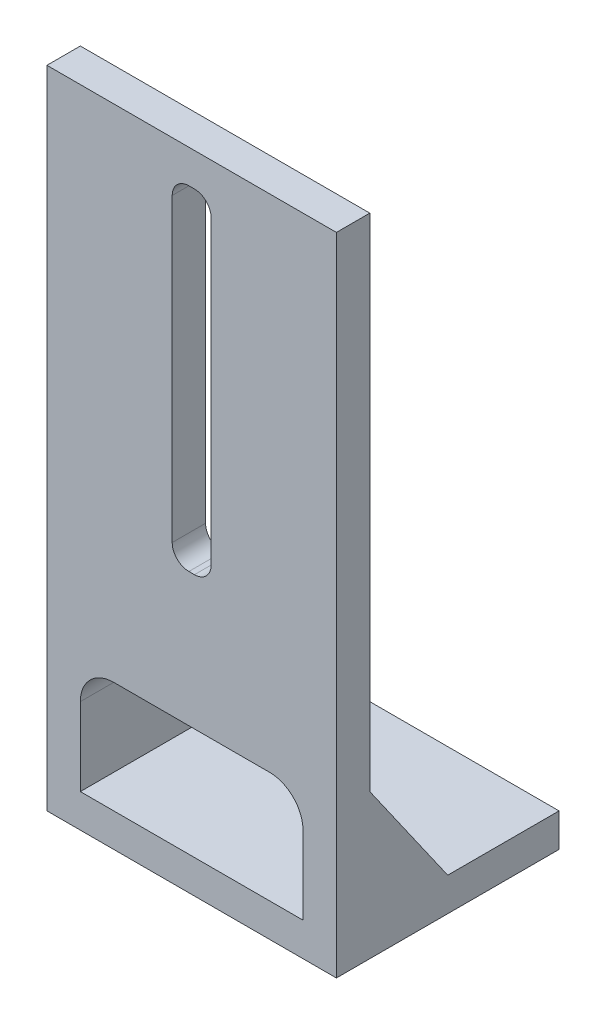
ISO-10303-21;
HEADER;
FILE_DESCRIPTION(('STEP AP214'),'2;1');
FILE_NAME('part.step','',(''),(''),'','','');
FILE_SCHEMA(('AUTOMOTIVE_DESIGN { 1 0 10303 214 1 1 1 1 }'));
ENDSEC;
DATA;
#1=APPLICATION_CONTEXT('core data for automotive mechanical design processes');
#2=APPLICATION_PROTOCOL_DEFINITION('international standard','automotive_design',2000,#1);
#3=PRODUCT_CONTEXT('',#1,'mechanical');
#4=PRODUCT('Part','Part','',(#3));
#5=PRODUCT_RELATED_PRODUCT_CATEGORY('part','',(#4));
#6=PRODUCT_DEFINITION_FORMATION('','',#4);
#7=PRODUCT_DEFINITION_CONTEXT('part definition',#1,'design');
#8=PRODUCT_DEFINITION('design','',#6,#7);
#9=PRODUCT_DEFINITION_SHAPE('','',#8);
#10=(LENGTH_UNIT() NAMED_UNIT(*) SI_UNIT(.MILLI.,.METRE.));
#11=(NAMED_UNIT(*) PLANE_ANGLE_UNIT() SI_UNIT($,.RADIAN.));
#12=(NAMED_UNIT(*) SI_UNIT($,.STERADIAN.) SOLID_ANGLE_UNIT());
#13=UNCERTAINTY_MEASURE_WITH_UNIT(LENGTH_MEASURE(1.E-05),#10,'distance_accuracy_value','');
#14=(GEOMETRIC_REPRESENTATION_CONTEXT(3) GLOBAL_UNCERTAINTY_ASSIGNED_CONTEXT((#13)) GLOBAL_UNIT_ASSIGNED_CONTEXT((#10,
#11,#12)) REPRESENTATION_CONTEXT('',''));
#15=CARTESIAN_POINT('',(0.,0.,0.));
#16=DIRECTION('',(0.,0.,1.));
#17=DIRECTION('',(1.,0.,0.));
#18=AXIS2_PLACEMENT_3D('',#15,#16,#17);
#19=CARTESIAN_POINT('',(0.,3.,0.));
#20=DIRECTION('',(0.,1.,0.));
#21=DIRECTION('',(0.,0.,1.));
#22=AXIS2_PLACEMENT_3D('',#19,#20,#21);
#23=PLANE('',#22);
#24=DIRECTION('',(0.,0.,1.));
#25=VECTOR('',#24,1.);
#26=CARTESIAN_POINT('',(18.0779936587407,3.,7.95820729539502));
#27=LINE('',#26,#25);
#28=CARTESIAN_POINT('',(18.0779936587407,3.,0.958207295395011));
#29=VERTEX_POINT('',#28);
#30=CARTESIAN_POINT('',(18.0779936587407,3.,10.958207295395));
#31=VERTEX_POINT('',#30);
#32=EDGE_CURVE('E175',#29,#31,#27,.T.);
#33=ORIENTED_EDGE('',*,*,#32,.F.);
#34=DIRECTION('',(-1.,0.,0.));
#35=VECTOR('',#34,1.);
#36=CARTESIAN_POINT('',(18.0779936587407,3.,0.958207295395016));
#37=LINE('',#36,#35);
#38=CARTESIAN_POINT('',(21.0779936587407,3.,0.95820729539501));
#39=VERTEX_POINT('',#38);
#40=EDGE_CURVE('E188',#39,#29,#37,.T.);
#41=ORIENTED_EDGE('',*,*,#40,.F.);
#42=DIRECTION('',(0.,0.,-1.));
#43=VECTOR('',#42,1.);
#44=CARTESIAN_POINT('',(21.0779936587407,3.,-9.04179270460499));
#45=LINE('',#44,#43);
#46=CARTESIAN_POINT('',(21.0779936587407,3.,-9.04179270460499));
#47=VERTEX_POINT('',#46);
#48=EDGE_CURVE('E251',#39,#47,#45,.T.);
#49=ORIENTED_EDGE('',*,*,#48,.T.);
#50=DIRECTION('',(-1.,0.,0.));
#51=VECTOR('',#50,1.);
#52=CARTESIAN_POINT('',(-4.92200634125928,3.,-9.04179270460499));
#53=LINE('',#52,#51);
#54=CARTESIAN_POINT('',(-4.92200634125928,3.,-9.04179270460499));
#55=VERTEX_POINT('',#54);
#56=EDGE_CURVE('E254',#47,#55,#53,.T.);
#57=ORIENTED_EDGE('',*,*,#56,.T.);
#58=DIRECTION('',(0.,0.,1.));
#59=VECTOR('',#58,1.);
#60=CARTESIAN_POINT('',(-4.92200634125928,3.,-9.04179270460499));
#61=LINE('',#60,#59);
#62=CARTESIAN_POINT('',(-4.92200634125928,3.,0.958207295395017));
#63=VERTEX_POINT('',#62);
#64=EDGE_CURVE('E248',#55,#63,#61,.T.);
#65=ORIENTED_EDGE('',*,*,#64,.T.);
#66=DIRECTION('',(-1.,0.,0.));
#67=VECTOR('',#66,1.);
#68=CARTESIAN_POINT('',(-4.92200634125928,3.,0.958207295395016));
#69=LINE('',#68,#67);
#70=CARTESIAN_POINT('',(-1.92200634125929,3.,0.958207295395016));
#71=VERTEX_POINT('',#70);
#72=EDGE_CURVE('E228',#71,#63,#69,.T.);
#73=ORIENTED_EDGE('',*,*,#72,.F.);
#74=DIRECTION('',(0.,0.,-1.));
#75=VECTOR('',#74,1.);
#76=CARTESIAN_POINT('',(-1.92200634125928,3.,7.95820729539502));
#77=LINE('',#76,#75);
#78=CARTESIAN_POINT('',(-1.92200634125928,3.,10.958207295395));
#79=VERTEX_POINT('',#78);
#80=EDGE_CURVE('E195',#79,#71,#77,.T.);
#81=ORIENTED_EDGE('',*,*,#80,.F.);
#82=DIRECTION('',(1.,0.,0.));
#83=VECTOR('',#82,1.);
#84=CARTESIAN_POINT('',(18.0779936587407,3.,10.958207295395));
#85=LINE('',#84,#83);
#86=EDGE_CURVE('E192',#79,#31,#85,.T.);
#87=ORIENTED_EDGE('',*,*,#86,.T.);
#88=EDGE_LOOP('',(#33,#41,#49,#57,#65,#73,#81,#87));
#89=FACE_BOUND('',#88,.T.);
#90=ADVANCED_FACE('F32',(#89),#23,.T.);
#91=CARTESIAN_POINT('',(21.0779936587407,58.,7.95820729539501));
#92=DIRECTION('',(0.,0.,1.));
#93=DIRECTION('',(1.,0.,0.));
#94=AXIS2_PLACEMENT_3D('',#91,#92,#93);
#95=PLANE('',#94);
#96=DIRECTION('',(0.,1.,0.));
#97=VECTOR('',#96,1.);
#98=CARTESIAN_POINT('',(6.32799365874073,0.,7.95820729539502));
#99=LINE('',#98,#97);
#100=CARTESIAN_POINT('',(6.32799365874073,26.5,7.95820729539502));
#101=VERTEX_POINT('',#100);
#102=CARTESIAN_POINT('',(6.32799365874072,53.5,7.95820729539502));
#103=VERTEX_POINT('',#102);
#104=EDGE_CURVE('E336',#101,#103,#99,.T.);
#105=ORIENTED_EDGE('',*,*,#104,.F.);
#106=CARTESIAN_POINT('',(7.82799365874073,26.5,7.95820729539502));
#107=DIRECTION('',(0.,0.,1.));
#108=DIRECTION('',(1.,0.,0.));
#109=AXIS2_PLACEMENT_3D('',#106,#107,#108);
#110=CIRCLE('',#109,1.5);
#111=CARTESIAN_POINT('',(7.82799365874073,25.,7.95820729539501));
#112=VERTEX_POINT('',#111);
#113=EDGE_CURVE('E313',#101,#112,#110,.T.);
#114=ORIENTED_EDGE('',*,*,#113,.T.);
#115=DIRECTION('',(-1.,0.,0.));
#116=VECTOR('',#115,1.);
#117=CARTESIAN_POINT('',(0.,25.,7.95820729539502));
#118=LINE('',#117,#116);
#119=CARTESIAN_POINT('',(8.32799365874074,25.,7.95820729539501));
#120=VERTEX_POINT('',#119);
#121=EDGE_CURVE('E399',#120,#112,#118,.T.);
#122=ORIENTED_EDGE('',*,*,#121,.F.);
#123=CARTESIAN_POINT('',(8.32799365874074,26.5,7.95820729539501));
#124=DIRECTION('',(0.,0.,1.));
#125=DIRECTION('',(1.,0.,0.));
#126=AXIS2_PLACEMENT_3D('',#123,#124,#125);
#127=CIRCLE('',#126,1.5);
#128=CARTESIAN_POINT('',(9.82799365874074,26.5,7.95820729539501));
#129=VERTEX_POINT('',#128);
#130=EDGE_CURVE('E317',#120,#129,#127,.T.);
#131=ORIENTED_EDGE('',*,*,#130,.T.);
#132=DIRECTION('',(0.,-1.,0.));
#133=VECTOR('',#132,1.);
#134=CARTESIAN_POINT('',(9.82799365874076,0.,7.95820729539501));
#135=LINE('',#134,#133);
#136=CARTESIAN_POINT('',(9.82799365874072,53.5,7.95820729539501));
#137=VERTEX_POINT('',#136);
#138=EDGE_CURVE('E332',#137,#129,#135,.T.);
#139=ORIENTED_EDGE('',*,*,#138,.F.);
#140=CARTESIAN_POINT('',(8.32799365874072,53.5,7.95820729539501));
#141=DIRECTION('',(0.,0.,1.));
#142=DIRECTION('',(1.,0.,0.));
#143=AXIS2_PLACEMENT_3D('',#140,#141,#142);
#144=CIRCLE('',#143,1.5);
#145=CARTESIAN_POINT('',(8.32799365874072,55.,7.95820729539501));
#146=VERTEX_POINT('',#145);
#147=EDGE_CURVE('E320',#137,#146,#144,.T.);
#148=ORIENTED_EDGE('',*,*,#147,.T.);
#149=DIRECTION('',(1.,0.,0.));
#150=VECTOR('',#149,1.);
#151=CARTESIAN_POINT('',(0.,55.,7.95820729539502));
#152=LINE('',#151,#150);
#153=CARTESIAN_POINT('',(7.82799365874072,55.,7.95820729539501));
#154=VERTEX_POINT('',#153);
#155=EDGE_CURVE('E329',#154,#146,#152,.T.);
#156=ORIENTED_EDGE('',*,*,#155,.F.);
#157=CARTESIAN_POINT('',(7.82799365874072,53.5,7.95820729539502));
#158=DIRECTION('',(0.,0.,1.));
#159=DIRECTION('',(1.,0.,0.));
#160=AXIS2_PLACEMENT_3D('',#157,#158,#159);
#161=CIRCLE('',#160,1.5);
#162=EDGE_CURVE('E11',#154,#103,#161,.T.);
#163=ORIENTED_EDGE('',*,*,#162,.T.);
#164=EDGE_LOOP('',(#105,#114,#122,#131,#139,#148,#156,#163));
#165=FACE_BOUND('',#164,.T.);
#166=DIRECTION('',(1.,0.,0.));
#167=VECTOR('',#166,1.);
#168=CARTESIAN_POINT('',(18.0779936587407,13.,7.95820729539502));
#169=LINE('',#168,#167);
#170=CARTESIAN_POINT('',(15.0779936587407,13.,7.95820729539501));
#171=VERTEX_POINT('',#170);
#172=CARTESIAN_POINT('',(21.0779936587407,13.,7.95820729539501));
#173=VERTEX_POINT('',#172);
#174=EDGE_CURVE('E187',#171,#173,#169,.T.);
#175=ORIENTED_EDGE('',*,*,#174,.F.);
#176=DIRECTION('',(1.,0.,0.));
#177=VECTOR('',#176,1.);
#178=CARTESIAN_POINT('',(18.0779936587407,13.,7.95820729539501));
#179=LINE('',#178,#177);
#180=CARTESIAN_POINT('',(1.07799365874072,13.,7.95820729539502));
#181=VERTEX_POINT('',#180);
#182=EDGE_CURVE('E199',#181,#171,#179,.T.);
#183=ORIENTED_EDGE('',*,*,#182,.F.);
#184=DIRECTION('',(1.,0.,0.));
#185=VECTOR('',#184,1.);
#186=CARTESIAN_POINT('',(-4.92200634125928,13.,7.95820729539502));
#187=LINE('',#186,#185);
#188=CARTESIAN_POINT('',(-4.92200634125928,13.,7.95820729539502));
#189=VERTEX_POINT('',#188);
#190=EDGE_CURVE('E225',#189,#181,#187,.T.);
#191=ORIENTED_EDGE('',*,*,#190,.F.);
#192=DIRECTION('',(0.,-1.,0.));
#193=VECTOR('',#192,1.);
#194=CARTESIAN_POINT('',(-4.92200634125928,58.,7.95820729539502));
#195=LINE('',#194,#193);
#196=CARTESIAN_POINT('',(-4.92200634125928,58.,7.95820729539502));
#197=VERTEX_POINT('',#196);
#198=EDGE_CURVE('E241',#197,#189,#195,.T.);
#199=ORIENTED_EDGE('',*,*,#198,.F.);
#200=DIRECTION('',(-1.,0.,0.));
#201=VECTOR('',#200,1.);
#202=CARTESIAN_POINT('',(21.0779936587407,58.,7.95820729539501));
#203=LINE('',#202,#201);
#204=CARTESIAN_POINT('',(21.0779936587407,58.,7.95820729539501));
#205=VERTEX_POINT('',#204);
#206=EDGE_CURVE('E233',#205,#197,#203,.T.);
#207=ORIENTED_EDGE('',*,*,#206,.F.);
#208=DIRECTION('',(0.,-1.,0.));
#209=VECTOR('',#208,1.);
#210=CARTESIAN_POINT('',(21.0779936587407,58.,7.95820729539501));
#211=LINE('',#210,#209);
#212=EDGE_CURVE('E244',#205,#173,#211,.T.);
#213=ORIENTED_EDGE('',*,*,#212,.T.);
#214=EDGE_LOOP('',(#175,#183,#191,#199,#207,#213));
#215=FACE_BOUND('',#214,.T.);
#216=ADVANCED_FACE('F327',(#165,#215),#95,.F.);
#217=CARTESIAN_POINT('',(-4.92200634125928,3.,-9.04179270460499));
#218=DIRECTION('',(1.,0.,0.));
#219=DIRECTION('',(0.,0.,-1.));
#220=AXIS2_PLACEMENT_3D('',#217,#218,#219);
#221=PLANE('',#220);
#222=ORIENTED_EDGE('',*,*,#198,.T.);
#223=DIRECTION('',(0.,0.819231920519041,0.573462344363328));
#224=VECTOR('',#223,1.);
#225=CARTESIAN_POINT('',(-4.92200634125928,3.,0.958207295395017));
#226=LINE('',#225,#224);
#227=EDGE_CURVE('E198',#63,#189,#226,.T.);
#228=ORIENTED_EDGE('',*,*,#227,.F.);
#229=ORIENTED_EDGE('',*,*,#64,.F.);
#230=DIRECTION('',(0.,-1.,0.));
#231=VECTOR('',#230,1.);
#232=CARTESIAN_POINT('',(-4.92200634125928,3.,-9.04179270460499));
#233=LINE('',#232,#231);
#234=CARTESIAN_POINT('',(-4.92200634125928,0.,-9.04179270460499));
#235=VERTEX_POINT('',#234);
#236=EDGE_CURVE('E256',#55,#235,#233,.T.);
#237=ORIENTED_EDGE('',*,*,#236,.T.);
#238=DIRECTION('',(0.,0.,1.));
#239=VECTOR('',#238,1.);
#240=CARTESIAN_POINT('',(-4.92200634125928,0.,-9.04179270460499));
#241=LINE('',#240,#239);
#242=CARTESIAN_POINT('',(-4.92200634125928,0.,10.958207295395));
#243=VERTEX_POINT('',#242);
#244=EDGE_CURVE('E247',#235,#243,#241,.T.);
#245=ORIENTED_EDGE('',*,*,#244,.T.);
#246=DIRECTION('',(0.,-1.,0.));
#247=VECTOR('',#246,1.);
#248=CARTESIAN_POINT('',(-4.92200634125928,3.,10.958207295395));
#249=LINE('',#248,#247);
#250=CARTESIAN_POINT('',(-4.92200634125928,58.,10.958207295395));
#251=VERTEX_POINT('',#250);
#252=EDGE_CURVE('E272',#251,#243,#249,.T.);
#253=ORIENTED_EDGE('',*,*,#252,.F.);
#254=DIRECTION('',(0.,0.,1.));
#255=VECTOR('',#254,1.);
#256=CARTESIAN_POINT('',(-4.92200634125928,58.,10.958207295395));
#257=LINE('',#256,#255);
#258=EDGE_CURVE('E235',#197,#251,#257,.T.);
#259=ORIENTED_EDGE('',*,*,#258,.F.);
#260=EDGE_LOOP('',(#222,#228,#229,#237,#245,#253,#259));
#261=FACE_BOUND('',#260,.T.);
#262=ADVANCED_FACE('F354',(#261),#221,.F.);
#263=CARTESIAN_POINT('',(-4.92200634125928,3.,10.958207295395));
#264=DIRECTION('',(0.,0.,-1.));
#265=DIRECTION('',(-1.,0.,0.));
#266=AXIS2_PLACEMENT_3D('',#263,#264,#265);
#267=PLANE('',#266);
#268=DIRECTION('',(0.,1.,0.));
#269=VECTOR('',#268,1.);
#270=CARTESIAN_POINT('',(9.82799365874076,0.,10.958207295395));
#271=LINE('',#270,#269);
#272=CARTESIAN_POINT('',(9.82799365874074,26.5,10.958207295395));
#273=VERTEX_POINT('',#272);
#274=CARTESIAN_POINT('',(9.82799365874072,53.5,10.958207295395));
#275=VERTEX_POINT('',#274);
#276=EDGE_CURVE('E408',#273,#275,#271,.T.);
#277=ORIENTED_EDGE('',*,*,#276,.F.);
#278=CARTESIAN_POINT('',(8.32799365874074,26.5,10.958207295395));
#279=DIRECTION('',(0.,0.,-1.));
#280=DIRECTION('',(-1.,0.,0.));
#281=AXIS2_PLACEMENT_3D('',#278,#279,#280);
#282=CIRCLE('',#281,1.5);
#283=CARTESIAN_POINT('',(8.32799365874074,25.,10.958207295395));
#284=VERTEX_POINT('',#283);
#285=EDGE_CURVE('E315',#273,#284,#282,.T.);
#286=ORIENTED_EDGE('',*,*,#285,.T.);
#287=DIRECTION('',(1.,0.,0.));
#288=VECTOR('',#287,1.);
#289=CARTESIAN_POINT('',(0.,25.,10.958207295395));
#290=LINE('',#289,#288);
#291=CARTESIAN_POINT('',(7.82799365874073,25.,10.958207295395));
#292=VERTEX_POINT('',#291);
#293=EDGE_CURVE('E406',#292,#284,#290,.T.);
#294=ORIENTED_EDGE('',*,*,#293,.F.);
#295=CARTESIAN_POINT('',(7.82799365874073,26.5,10.958207295395));
#296=DIRECTION('',(0.,0.,-1.));
#297=DIRECTION('',(-1.,0.,0.));
#298=AXIS2_PLACEMENT_3D('',#295,#296,#297);
#299=CIRCLE('',#298,1.5);
#300=CARTESIAN_POINT('',(6.32799365874073,26.5,10.958207295395));
#301=VERTEX_POINT('',#300);
#302=EDGE_CURVE('E311',#292,#301,#299,.T.);
#303=ORIENTED_EDGE('',*,*,#302,.T.);
#304=DIRECTION('',(0.,-1.,0.));
#305=VECTOR('',#304,1.);
#306=CARTESIAN_POINT('',(6.32799365874073,0.,10.958207295395));
#307=LINE('',#306,#305);
#308=CARTESIAN_POINT('',(6.32799365874072,53.5,10.958207295395));
#309=VERTEX_POINT('',#308);
#310=EDGE_CURVE('E416',#309,#301,#307,.T.);
#311=ORIENTED_EDGE('',*,*,#310,.F.);
#312=CARTESIAN_POINT('',(7.82799365874072,53.5,10.958207295395));
#313=DIRECTION('',(0.,0.,-1.));
#314=DIRECTION('',(-1.,0.,0.));
#315=AXIS2_PLACEMENT_3D('',#312,#313,#314);
#316=CIRCLE('',#315,1.5);
#317=CARTESIAN_POINT('',(7.82799365874072,55.,10.958207295395));
#318=VERTEX_POINT('',#317);
#319=EDGE_CURVE('E40',#309,#318,#316,.T.);
#320=ORIENTED_EDGE('',*,*,#319,.T.);
#321=DIRECTION('',(-1.,0.,0.));
#322=VECTOR('',#321,1.);
#323=CARTESIAN_POINT('',(0.,55.,10.958207295395));
#324=LINE('',#323,#322);
#325=CARTESIAN_POINT('',(8.32799365874072,55.,10.958207295395));
#326=VERTEX_POINT('',#325);
#327=EDGE_CURVE('E414',#326,#318,#324,.T.);
#328=ORIENTED_EDGE('',*,*,#327,.F.);
#329=CARTESIAN_POINT('',(8.32799365874072,53.5,10.958207295395));
#330=DIRECTION('',(0.,0.,-1.));
#331=DIRECTION('',(-1.,0.,0.));
#332=AXIS2_PLACEMENT_3D('',#329,#330,#331);
#333=CIRCLE('',#332,1.5);
#334=EDGE_CURVE('E54',#326,#275,#333,.T.);
#335=ORIENTED_EDGE('',*,*,#334,.T.);
#336=EDGE_LOOP('',(#277,#286,#294,#303,#311,#320,#328,#335));
#337=FACE_BOUND('',#336,.T.);
#338=DIRECTION('',(-1.,0.,0.));
#339=VECTOR('',#338,1.);
#340=CARTESIAN_POINT('',(18.0779936587407,13.,10.958207295395));
#341=LINE('',#340,#339);
#342=CARTESIAN_POINT('',(15.0779936587407,13.,10.958207295395));
#343=VERTEX_POINT('',#342);
#344=CARTESIAN_POINT('',(1.07799365874072,13.,10.958207295395));
#345=VERTEX_POINT('',#344);
#346=EDGE_CURVE('E206',#343,#345,#341,.T.);
#347=ORIENTED_EDGE('',*,*,#346,.F.);
#348=CARTESIAN_POINT('',(15.0779936587407,10.,10.958207295395));
#349=DIRECTION('',(0.,0.,-1.));
#350=DIRECTION('',(-1.,0.,0.));
#351=AXIS2_PLACEMENT_3D('',#348,#349,#350);
#352=CIRCLE('',#351,3.);
#353=CARTESIAN_POINT('',(18.0779936587407,10.,10.958207295395));
#354=VERTEX_POINT('',#353);
#355=EDGE_CURVE('E205',#343,#354,#352,.T.);
#356=ORIENTED_EDGE('',*,*,#355,.T.);
#357=DIRECTION('',(0.,1.,0.));
#358=VECTOR('',#357,1.);
#359=CARTESIAN_POINT('',(18.0779936587407,3.,10.958207295395));
#360=LINE('',#359,#358);
#361=EDGE_CURVE('E180',#31,#354,#360,.T.);
#362=ORIENTED_EDGE('',*,*,#361,.F.);
#363=ORIENTED_EDGE('',*,*,#86,.F.);
#364=DIRECTION('',(0.,-1.,0.));
#365=VECTOR('',#364,1.);
#366=CARTESIAN_POINT('',(-1.92200634125928,3.,10.958207295395));
#367=LINE('',#366,#365);
#368=CARTESIAN_POINT('',(-1.92200634125928,10.,10.958207295395));
#369=VERTEX_POINT('',#368);
#370=EDGE_CURVE('E211',#369,#79,#367,.T.);
#371=ORIENTED_EDGE('',*,*,#370,.F.);
#372=CARTESIAN_POINT('',(1.07799365874072,10.,10.958207295395));
#373=DIRECTION('',(0.,0.,-1.));
#374=DIRECTION('',(-1.,0.,0.));
#375=AXIS2_PLACEMENT_3D('',#372,#373,#374);
#376=CIRCLE('',#375,3.);
#377=EDGE_CURVE('E286',#369,#345,#376,.T.);
#378=ORIENTED_EDGE('',*,*,#377,.T.);
#379=EDGE_LOOP('',(#347,#356,#362,#363,#371,#378));
#380=FACE_BOUND('',#379,.T.);
#381=DIRECTION('',(1.,0.,0.));
#382=VECTOR('',#381,1.);
#383=CARTESIAN_POINT('',(-4.92200634125928,0.,10.958207295395));
#384=LINE('',#383,#382);
#385=CARTESIAN_POINT('',(21.0779936587407,0.,10.958207295395));
#386=VERTEX_POINT('',#385);
#387=EDGE_CURVE('E259',#243,#386,#384,.T.);
#388=ORIENTED_EDGE('',*,*,#387,.T.);
#389=DIRECTION('',(0.,-1.,0.));
#390=VECTOR('',#389,1.);
#391=CARTESIAN_POINT('',(21.0779936587407,3.,10.958207295395));
#392=LINE('',#391,#390);
#393=CARTESIAN_POINT('',(21.0779936587407,58.,10.958207295395));
#394=VERTEX_POINT('',#393);
#395=EDGE_CURVE('E269',#394,#386,#392,.T.);
#396=ORIENTED_EDGE('',*,*,#395,.F.);
#397=DIRECTION('',(1.,0.,0.));
#398=VECTOR('',#397,1.);
#399=CARTESIAN_POINT('',(21.0779936587407,58.,10.958207295395));
#400=LINE('',#399,#398);
#401=EDGE_CURVE('E238',#251,#394,#400,.T.);
#402=ORIENTED_EDGE('',*,*,#401,.F.);
#403=ORIENTED_EDGE('',*,*,#252,.T.);
#404=EDGE_LOOP('',(#388,#396,#402,#403));
#405=FACE_BOUND('',#404,.T.);
#406=ADVANCED_FACE('F202',(#337,#380,#405),#267,.F.);
#407=CARTESIAN_POINT('',(21.0779936587407,3.,-9.04179270460499));
#408=DIRECTION('',(-1.,0.,0.));
#409=DIRECTION('',(0.,0.,1.));
#410=AXIS2_PLACEMENT_3D('',#407,#408,#409);
#411=PLANE('',#410);
#412=ORIENTED_EDGE('',*,*,#48,.F.);
#413=DIRECTION('',(0.,0.819231920519041,0.573462344363328));
#414=VECTOR('',#413,1.);
#415=CARTESIAN_POINT('',(21.0779936587407,3.,0.95820729539501));
#416=LINE('',#415,#414);
#417=EDGE_CURVE('E215',#39,#173,#416,.T.);
#418=ORIENTED_EDGE('',*,*,#417,.T.);
#419=ORIENTED_EDGE('',*,*,#212,.F.);
#420=DIRECTION('',(0.,0.,-1.));
#421=VECTOR('',#420,1.);
#422=CARTESIAN_POINT('',(21.0779936587407,58.,10.958207295395));
#423=LINE('',#422,#421);
#424=EDGE_CURVE('E227',#394,#205,#423,.T.);
#425=ORIENTED_EDGE('',*,*,#424,.F.);
#426=ORIENTED_EDGE('',*,*,#395,.T.);
#427=DIRECTION('',(0.,0.,-1.));
#428=VECTOR('',#427,1.);
#429=CARTESIAN_POINT('',(21.0779936587407,0.,-9.04179270460499));
#430=LINE('',#429,#428);
#431=CARTESIAN_POINT('',(21.0779936587407,0.,-9.04179270460499));
#432=VERTEX_POINT('',#431);
#433=EDGE_CURVE('E261',#386,#432,#430,.T.);
#434=ORIENTED_EDGE('',*,*,#433,.T.);
#435=DIRECTION('',(0.,-1.,0.));
#436=VECTOR('',#435,1.);
#437=CARTESIAN_POINT('',(21.0779936587407,3.,-9.04179270460499));
#438=LINE('',#437,#436);
#439=EDGE_CURVE('E266',#47,#432,#438,.T.);
#440=ORIENTED_EDGE('',*,*,#439,.F.);
#441=EDGE_LOOP('',(#412,#418,#419,#425,#426,#434,#440));
#442=FACE_BOUND('',#441,.T.);
#443=ADVANCED_FACE('F366',(#442),#411,.F.);
#444=CARTESIAN_POINT('',(-4.92200634125928,3.,-9.04179270460499));
#445=DIRECTION('',(0.,0.,1.));
#446=DIRECTION('',(1.,0.,0.));
#447=AXIS2_PLACEMENT_3D('',#444,#445,#446);
#448=PLANE('',#447);
#449=DIRECTION('',(-1.,0.,0.));
#450=VECTOR('',#449,1.);
#451=CARTESIAN_POINT('',(-4.92200634125928,0.,-9.04179270460499));
#452=LINE('',#451,#450);
#453=EDGE_CURVE('E252',#432,#235,#452,.T.);
#454=ORIENTED_EDGE('',*,*,#453,.T.);
#455=ORIENTED_EDGE('',*,*,#236,.F.);
#456=ORIENTED_EDGE('',*,*,#56,.F.);
#457=ORIENTED_EDGE('',*,*,#439,.T.);
#458=EDGE_LOOP('',(#454,#455,#456,#457));
#459=FACE_BOUND('',#458,.T.);
#460=ADVANCED_FACE('F362',(#459),#448,.F.);
#461=CARTESIAN_POINT('',(0.,0.,0.));
#462=DIRECTION('',(0.,1.,0.));
#463=DIRECTION('',(0.,0.,1.));
#464=AXIS2_PLACEMENT_3D('',#461,#462,#463);
#465=PLANE('',#464);
#466=ORIENTED_EDGE('',*,*,#244,.F.);
#467=ORIENTED_EDGE('',*,*,#453,.F.);
#468=ORIENTED_EDGE('',*,*,#433,.F.);
#469=ORIENTED_EDGE('',*,*,#387,.F.);
#470=EDGE_LOOP('',(#466,#467,#468,#469));
#471=FACE_BOUND('',#470,.T.);
#472=ADVANCED_FACE('F358',(#471),#465,.F.);
#473=CARTESIAN_POINT('',(0.,58.,0.));
#474=DIRECTION('',(0.,1.,0.));
#475=DIRECTION('',(0.,0.,1.));
#476=AXIS2_PLACEMENT_3D('',#473,#474,#475);
#477=PLANE('',#476);
#478=ORIENTED_EDGE('',*,*,#424,.T.);
#479=ORIENTED_EDGE('',*,*,#206,.T.);
#480=ORIENTED_EDGE('',*,*,#258,.T.);
#481=ORIENTED_EDGE('',*,*,#401,.T.);
#482=EDGE_LOOP('',(#478,#479,#480,#481));
#483=FACE_BOUND('',#482,.T.);
#484=ADVANCED_FACE('F361',(#483),#477,.T.);
#485=CARTESIAN_POINT('',(-1.92200634125928,13.,7.95820729539502));
#486=DIRECTION('',(-1.,0.,0.));
#487=DIRECTION('',(0.,0.,1.));
#488=AXIS2_PLACEMENT_3D('',#485,#486,#487);
#489=PLANE('',#488);
#490=DIRECTION('',(0.,0.819231920519041,0.573462344363328));
#491=VECTOR('',#490,1.);
#492=CARTESIAN_POINT('',(-1.92200634125928,13.,7.95820729539501));
#493=LINE('',#492,#491);
#494=CARTESIAN_POINT('',(-1.92200634125928,10.,5.85820729539501));
#495=VERTEX_POINT('',#494);
#496=EDGE_CURVE('E220',#71,#495,#493,.T.);
#497=ORIENTED_EDGE('',*,*,#496,.T.);
#498=DIRECTION('',(0.,0.,-1.));
#499=VECTOR('',#498,1.);
#500=CARTESIAN_POINT('',(-1.92200634125928,10.,10.958207295395));
#501=LINE('',#500,#499);
#502=EDGE_CURVE('E280',#495,#369,#501,.F.);
#503=ORIENTED_EDGE('',*,*,#502,.T.);
#504=ORIENTED_EDGE('',*,*,#370,.T.);
#505=ORIENTED_EDGE('',*,*,#80,.T.);
#506=EDGE_LOOP('',(#497,#503,#504,#505));
#507=FACE_BOUND('',#506,.T.);
#508=ADVANCED_FACE('F420',(#507),#489,.F.);
#509=CARTESIAN_POINT('',(18.0779936587407,13.,7.95820729539502));
#510=DIRECTION('',(1.,0.,0.));
#511=DIRECTION('',(0.,0.,-1.));
#512=AXIS2_PLACEMENT_3D('',#509,#510,#511);
#513=PLANE('',#512);
#514=ORIENTED_EDGE('',*,*,#361,.T.);
#515=DIRECTION('',(0.,0.,-1.));
#516=VECTOR('',#515,1.);
#517=CARTESIAN_POINT('',(18.0779936587407,10.,7.95820729539501));
#518=LINE('',#517,#516);
#519=CARTESIAN_POINT('',(18.0779936587407,10.,5.85820729539501));
#520=VERTEX_POINT('',#519);
#521=EDGE_CURVE('E282',#354,#520,#518,.T.);
#522=ORIENTED_EDGE('',*,*,#521,.T.);
#523=DIRECTION('',(0.,-0.819231920519041,-0.573462344363328));
#524=VECTOR('',#523,1.);
#525=CARTESIAN_POINT('',(18.0779936587407,13.,7.95820729539501));
#526=LINE('',#525,#524);
#527=EDGE_CURVE('E183',#520,#29,#526,.T.);
#528=ORIENTED_EDGE('',*,*,#527,.T.);
#529=ORIENTED_EDGE('',*,*,#32,.T.);
#530=EDGE_LOOP('',(#514,#522,#528,#529));
#531=FACE_BOUND('',#530,.T.);
#532=ADVANCED_FACE('F177',(#531),#513,.F.);
#533=CARTESIAN_POINT('',(21.0779936587407,3.,0.95820729539501));
#534=DIRECTION('',(0.,-0.573462344363328,0.819231920519041));
#535=DIRECTION('',(0.,-0.819231920519041,-0.573462344363328));
#536=AXIS2_PLACEMENT_3D('',#533,#534,#535);
#537=PLANE('',#536);
#538=ORIENTED_EDGE('',*,*,#174,.T.);
#539=ORIENTED_EDGE('',*,*,#417,.F.);
#540=ORIENTED_EDGE('',*,*,#40,.T.);
#541=ORIENTED_EDGE('',*,*,#527,.F.);
#542=CARTESIAN_POINT('',(15.0779936587407,10.,5.85820729539501));
#543=DIRECTION('',(0.,-0.573462344363328,0.819231920519041));
#544=DIRECTION('',(0.,0.819231920519041,0.573462344363328));
#545=AXIS2_PLACEMENT_3D('',#542,#543,#544);
#546=ELLIPSE('',#545,3.66196668472011,3.);
#547=EDGE_CURVE('E288',#520,#171,#546,.T.);
#548=ORIENTED_EDGE('',*,*,#547,.T.);
#549=EDGE_LOOP('',(#538,#539,#540,#541,#548));
#550=FACE_BOUND('',#549,.T.);
#551=ADVANCED_FACE('F431',(#550),#537,.F.);
#552=ORIENTED_EDGE('',*,*,#72,.T.);
#553=ORIENTED_EDGE('',*,*,#227,.T.);
#554=ORIENTED_EDGE('',*,*,#190,.T.);
#555=CARTESIAN_POINT('',(1.07799365874072,10.,5.85820729539501));
#556=DIRECTION('',(0.,-0.573462344363328,0.819231920519041));
#557=DIRECTION('',(0.,0.819231920519041,0.573462344363328));
#558=AXIS2_PLACEMENT_3D('',#555,#556,#557);
#559=ELLIPSE('',#558,3.66196668472011,3.);
#560=EDGE_CURVE('E284',#181,#495,#559,.T.);
#561=ORIENTED_EDGE('',*,*,#560,.T.);
#562=ORIENTED_EDGE('',*,*,#496,.F.);
#563=EDGE_LOOP('',(#552,#553,#554,#561,#562));
#564=FACE_BOUND('',#563,.T.);
#565=ADVANCED_FACE('F444',(#564),#537,.F.);
#566=CARTESIAN_POINT('',(18.0779936587407,13.,10.959207295395));
#567=DIRECTION('',(0.,1.,0.));
#568=DIRECTION('',(0.,0.,1.));
#569=AXIS2_PLACEMENT_3D('',#566,#567,#568);
#570=PLANE('',#569);
#571=ORIENTED_EDGE('',*,*,#346,.T.);
#572=DIRECTION('',(0.,0.,-1.));
#573=VECTOR('',#572,1.);
#574=CARTESIAN_POINT('',(1.07799365874072,13.,7.95820729539502));
#575=LINE('',#574,#573);
#576=EDGE_CURVE('E277',#345,#181,#575,.T.);
#577=ORIENTED_EDGE('',*,*,#576,.T.);
#578=ORIENTED_EDGE('',*,*,#182,.T.);
#579=DIRECTION('',(0.,0.,-1.));
#580=VECTOR('',#579,1.);
#581=CARTESIAN_POINT('',(15.0779936587407,13.,10.958207295395));
#582=LINE('',#581,#580);
#583=EDGE_CURVE('E275',#171,#343,#582,.F.);
#584=ORIENTED_EDGE('',*,*,#583,.T.);
#585=EDGE_LOOP('',(#571,#577,#578,#584));
#586=FACE_BOUND('',#585,.T.);
#587=ADVANCED_FACE('F380',(#586),#570,.F.);
#588=CARTESIAN_POINT('',(1.07799365874072,10.,10.959207295395));
#589=DIRECTION('',(0.,0.,1.));
#590=DIRECTION('',(1.,0.,0.));
#591=AXIS2_PLACEMENT_3D('',#588,#589,#590);
#592=CYLINDRICAL_SURFACE('',#591,3.);
#593=ORIENTED_EDGE('',*,*,#377,.F.);
#594=ORIENTED_EDGE('',*,*,#502,.F.);
#595=ORIENTED_EDGE('',*,*,#560,.F.);
#596=ORIENTED_EDGE('',*,*,#576,.F.);
#597=EDGE_LOOP('',(#593,#594,#595,#596));
#598=FACE_BOUND('',#597,.T.);
#599=ADVANCED_FACE('F376',(#598),#592,.F.);
#600=CARTESIAN_POINT('',(15.0779936587407,10.,7.95820729539502));
#601=DIRECTION('',(0.,0.,1.));
#602=DIRECTION('',(1.,0.,0.));
#603=AXIS2_PLACEMENT_3D('',#600,#601,#602);
#604=CYLINDRICAL_SURFACE('',#603,3.);
#605=ORIENTED_EDGE('',*,*,#355,.F.);
#606=ORIENTED_EDGE('',*,*,#583,.F.);
#607=ORIENTED_EDGE('',*,*,#547,.F.);
#608=ORIENTED_EDGE('',*,*,#521,.F.);
#609=EDGE_LOOP('',(#605,#606,#607,#608));
#610=FACE_BOUND('',#609,.T.);
#611=ADVANCED_FACE('F379',(#610),#604,.F.);
#612=CARTESIAN_POINT('',(0.,25.,-9.04279270460499));
#613=DIRECTION('',(0.,-1.,0.));
#614=DIRECTION('',(0.,0.,-1.));
#615=AXIS2_PLACEMENT_3D('',#612,#613,#614);
#616=PLANE('',#615);
#617=ORIENTED_EDGE('',*,*,#121,.T.);
#618=DIRECTION('',(0.,0.,1.));
#619=VECTOR('',#618,1.);
#620=CARTESIAN_POINT('',(7.82799365874073,25.,10.958207295395));
#621=LINE('',#620,#619);
#622=EDGE_CURVE('E294',#112,#292,#621,.T.);
#623=ORIENTED_EDGE('',*,*,#622,.T.);
#624=ORIENTED_EDGE('',*,*,#293,.T.);
#625=DIRECTION('',(0.,0.,1.));
#626=VECTOR('',#625,1.);
#627=CARTESIAN_POINT('',(8.32799365874074,25.,7.95820729539501));
#628=LINE('',#627,#626);
#629=EDGE_CURVE('E292',#284,#120,#628,.F.);
#630=ORIENTED_EDGE('',*,*,#629,.T.);
#631=EDGE_LOOP('',(#617,#623,#624,#630));
#632=FACE_BOUND('',#631,.T.);
#633=ADVANCED_FACE('F384',(#632),#616,.F.);
#634=CARTESIAN_POINT('',(6.32799365874073,0.,-9.04279270460499));
#635=DIRECTION('',(-1.,0.,0.));
#636=DIRECTION('',(0.,-1.,0.));
#637=AXIS2_PLACEMENT_3D('',#634,#635,#636);
#638=PLANE('',#637);
#639=ORIENTED_EDGE('',*,*,#310,.T.);
#640=DIRECTION('',(0.,0.,1.));
#641=VECTOR('',#640,1.);
#642=CARTESIAN_POINT('',(6.32799365874073,26.5,7.95820729539502));
#643=LINE('',#642,#641);
#644=EDGE_CURVE('E300',#301,#101,#643,.F.);
#645=ORIENTED_EDGE('',*,*,#644,.T.);
#646=ORIENTED_EDGE('',*,*,#104,.T.);
#647=DIRECTION('',(0.,0.,1.));
#648=VECTOR('',#647,1.);
#649=CARTESIAN_POINT('',(6.32799365874072,53.5,10.958207295395));
#650=LINE('',#649,#648);
#651=EDGE_CURVE('E297',#103,#309,#650,.T.);
#652=ORIENTED_EDGE('',*,*,#651,.T.);
#653=EDGE_LOOP('',(#639,#645,#646,#652));
#654=FACE_BOUND('',#653,.T.);
#655=ADVANCED_FACE('F527',(#654),#638,.F.);
#656=CARTESIAN_POINT('',(0.,55.,-9.04279270460499));
#657=DIRECTION('',(0.,1.,0.));
#658=DIRECTION('',(0.,0.,1.));
#659=AXIS2_PLACEMENT_3D('',#656,#657,#658);
#660=PLANE('',#659);
#661=ORIENTED_EDGE('',*,*,#155,.T.);
#662=DIRECTION('',(0.,0.,1.));
#663=VECTOR('',#662,1.);
#664=CARTESIAN_POINT('',(8.32799365874072,55.,10.958207295395));
#665=LINE('',#664,#663);
#666=EDGE_CURVE('E309',#146,#326,#665,.T.);
#667=ORIENTED_EDGE('',*,*,#666,.T.);
#668=ORIENTED_EDGE('',*,*,#327,.T.);
#669=DIRECTION('',(0.,0.,1.));
#670=VECTOR('',#669,1.);
#671=CARTESIAN_POINT('',(7.82799365874072,55.,7.95820729539502));
#672=LINE('',#671,#670);
#673=EDGE_CURVE('E307',#318,#154,#672,.F.);
#674=ORIENTED_EDGE('',*,*,#673,.T.);
#675=EDGE_LOOP('',(#661,#667,#668,#674));
#676=FACE_BOUND('',#675,.T.);
#677=ADVANCED_FACE('F334',(#676),#660,.F.);
#678=CARTESIAN_POINT('',(9.82799365874076,0.,-9.04279270460499));
#679=DIRECTION('',(1.,0.,0.));
#680=DIRECTION('',(0.,1.,0.));
#681=AXIS2_PLACEMENT_3D('',#678,#679,#680);
#682=PLANE('',#681);
#683=ORIENTED_EDGE('',*,*,#138,.T.);
#684=DIRECTION('',(0.,0.,1.));
#685=VECTOR('',#684,1.);
#686=CARTESIAN_POINT('',(9.82799365874074,26.5,10.958207295395));
#687=LINE('',#686,#685);
#688=EDGE_CURVE('E304',#129,#273,#687,.T.);
#689=ORIENTED_EDGE('',*,*,#688,.T.);
#690=ORIENTED_EDGE('',*,*,#276,.T.);
#691=DIRECTION('',(0.,0.,1.));
#692=VECTOR('',#691,1.);
#693=CARTESIAN_POINT('',(9.82799365874072,53.5,7.95820729539502));
#694=LINE('',#693,#692);
#695=EDGE_CURVE('E302',#275,#137,#694,.F.);
#696=ORIENTED_EDGE('',*,*,#695,.T.);
#697=EDGE_LOOP('',(#683,#689,#690,#696));
#698=FACE_BOUND('',#697,.T.);
#699=ADVANCED_FACE('F387',(#698),#682,.F.);
#700=CARTESIAN_POINT('',(7.82799365874073,26.5,-9.04279270460499));
#701=DIRECTION('',(0.,0.,-1.));
#702=DIRECTION('',(-1.,0.,0.));
#703=AXIS2_PLACEMENT_3D('',#700,#701,#702);
#704=CYLINDRICAL_SURFACE('',#703,1.5);
#705=ORIENTED_EDGE('',*,*,#113,.F.);
#706=ORIENTED_EDGE('',*,*,#644,.F.);
#707=ORIENTED_EDGE('',*,*,#302,.F.);
#708=ORIENTED_EDGE('',*,*,#622,.F.);
#709=EDGE_LOOP('',(#705,#706,#707,#708));
#710=FACE_BOUND('',#709,.T.);
#711=ADVANCED_FACE('F346',(#710),#704,.F.);
#712=CARTESIAN_POINT('',(8.32799365874074,26.5,-9.04279270460499));
#713=DIRECTION('',(0.,0.,-1.));
#714=DIRECTION('',(-1.,0.,0.));
#715=AXIS2_PLACEMENT_3D('',#712,#713,#714);
#716=CYLINDRICAL_SURFACE('',#715,1.5);
#717=ORIENTED_EDGE('',*,*,#130,.F.);
#718=ORIENTED_EDGE('',*,*,#629,.F.);
#719=ORIENTED_EDGE('',*,*,#285,.F.);
#720=ORIENTED_EDGE('',*,*,#688,.F.);
#721=EDGE_LOOP('',(#717,#718,#719,#720));
#722=FACE_BOUND('',#721,.T.);
#723=ADVANCED_FACE('F340',(#722),#716,.F.);
#724=CARTESIAN_POINT('',(8.32799365874072,53.5,-9.04279270460499));
#725=DIRECTION('',(0.,0.,-1.));
#726=DIRECTION('',(-1.,0.,0.));
#727=AXIS2_PLACEMENT_3D('',#724,#725,#726);
#728=CYLINDRICAL_SURFACE('',#727,1.5);
#729=ORIENTED_EDGE('',*,*,#147,.F.);
#730=ORIENTED_EDGE('',*,*,#695,.F.);
#731=ORIENTED_EDGE('',*,*,#334,.F.);
#732=ORIENTED_EDGE('',*,*,#666,.F.);
#733=EDGE_LOOP('',(#729,#730,#731,#732));
#734=FACE_BOUND('',#733,.T.);
#735=ADVANCED_FACE('F338',(#734),#728,.F.);
#736=CARTESIAN_POINT('',(7.82799365874072,53.5,-9.04279270460499));
#737=DIRECTION('',(0.,0.,-1.));
#738=DIRECTION('',(-1.,0.,0.));
#739=AXIS2_PLACEMENT_3D('',#736,#737,#738);
#740=CYLINDRICAL_SURFACE('',#739,1.5);
#741=ORIENTED_EDGE('',*,*,#162,.F.);
#742=ORIENTED_EDGE('',*,*,#673,.F.);
#743=ORIENTED_EDGE('',*,*,#319,.F.);
#744=ORIENTED_EDGE('',*,*,#651,.F.);
#745=EDGE_LOOP('',(#741,#742,#743,#744));
#746=FACE_BOUND('',#745,.T.);
#747=ADVANCED_FACE('F34',(#746),#740,.F.);
#748=CLOSED_SHELL('',(#90,#216,#262,#406,#443,#460,#472,#484,#508,#532,#551,#565,#587,#599,#611,
#633,#655,#677,#699,#711,#723,#735,#747));
#749=MANIFOLD_SOLID_BREP('B2',#748);
#750=ADVANCED_BREP_SHAPE_REPRESENTATION('',(#18,#749),#14);
#751=SHAPE_DEFINITION_REPRESENTATION(#9,#750);
ENDSEC;
END-ISO-10303-21;
